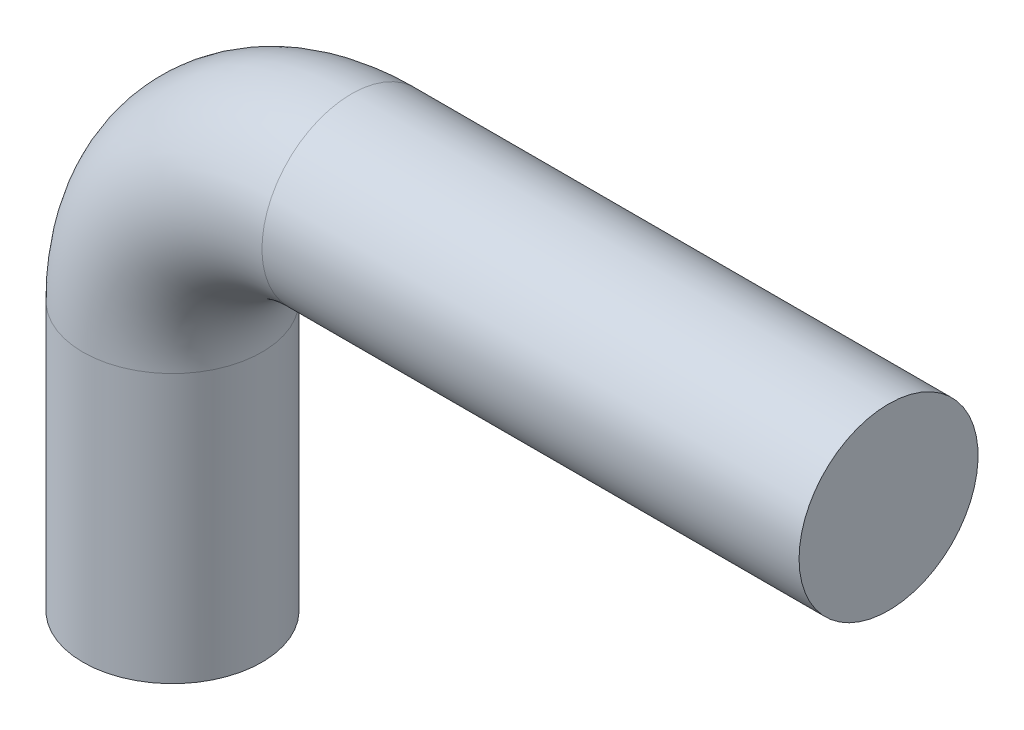
ISO-10303-21;
HEADER;
FILE_DESCRIPTION(('STEP AP214'),'2;1');
FILE_NAME('part.step','',(''),(''),'','','');
FILE_SCHEMA(('AUTOMOTIVE_DESIGN { 1 0 10303 214 1 1 1 1 }'));
ENDSEC;
DATA;
#1=APPLICATION_CONTEXT('core data for automotive mechanical design processes');
#2=APPLICATION_PROTOCOL_DEFINITION('international standard','automotive_design',2000,#1);
#3=PRODUCT_CONTEXT('',#1,'mechanical');
#4=PRODUCT('Part','Part','',(#3));
#5=PRODUCT_RELATED_PRODUCT_CATEGORY('part','',(#4));
#6=PRODUCT_DEFINITION_FORMATION('','',#4);
#7=PRODUCT_DEFINITION_CONTEXT('part definition',#1,'design');
#8=PRODUCT_DEFINITION('design','',#6,#7);
#9=PRODUCT_DEFINITION_SHAPE('','',#8);
#10=(LENGTH_UNIT() NAMED_UNIT(*) SI_UNIT(.MILLI.,.METRE.));
#11=(NAMED_UNIT(*) PLANE_ANGLE_UNIT() SI_UNIT($,.RADIAN.));
#12=(NAMED_UNIT(*) SI_UNIT($,.STERADIAN.) SOLID_ANGLE_UNIT());
#13=UNCERTAINTY_MEASURE_WITH_UNIT(LENGTH_MEASURE(1.E-05),#10,'distance_accuracy_value','');
#14=(GEOMETRIC_REPRESENTATION_CONTEXT(3) GLOBAL_UNCERTAINTY_ASSIGNED_CONTEXT((#13)) GLOBAL_UNIT_ASSIGNED_CONTEXT((#10,
#11,#12)) REPRESENTATION_CONTEXT('',''));
#15=CARTESIAN_POINT('',(0.,0.,0.));
#16=DIRECTION('',(0.,0.,1.));
#17=DIRECTION('',(1.,0.,0.));
#18=AXIS2_PLACEMENT_3D('',#15,#16,#17);
#19=CARTESIAN_POINT('',(0.,0.,0.));
#20=DIRECTION('',(0.,-1.,0.));
#21=DIRECTION('',(0.,0.,1.));
#22=AXIS2_PLACEMENT_3D('',#19,#20,#21);
#23=PLANE('',#22);
#24=CARTESIAN_POINT('',(0.,0.,0.));
#25=DIRECTION('',(0.,-1.,0.));
#26=DIRECTION('',(0.,0.,1.));
#27=AXIS2_PLACEMENT_3D('',#24,#25,#26);
#28=CIRCLE('',#27,5.);
#29=CARTESIAN_POINT('',(0.,0.,5.));
#30=VERTEX_POINT('',#29);
#31=EDGE_CURVE('E59',#30,#30,#28,.T.);
#32=ORIENTED_EDGE('',*,*,#31,.T.);
#33=EDGE_LOOP('',(#32));
#34=FACE_BOUND('',#33,.T.);
#35=ADVANCED_FACE('F45',(#34),#23,.T.);
#36=CARTESIAN_POINT('',(40.,25.,0.));
#37=DIRECTION('',(-1.,0.,0.));
#38=DIRECTION('',(0.,0.,1.));
#39=AXIS2_PLACEMENT_3D('',#36,#37,#38);
#40=PLANE('',#39);
#41=CARTESIAN_POINT('',(40.,25.,0.));
#42=DIRECTION('',(-1.,0.,0.));
#43=DIRECTION('',(0.,0.,1.));
#44=AXIS2_PLACEMENT_3D('',#41,#42,#43);
#45=CIRCLE('',#44,5.);
#46=CARTESIAN_POINT('',(40.,25.,5.));
#47=VERTEX_POINT('',#46);
#48=EDGE_CURVE('E11',#47,#47,#45,.T.);
#49=ORIENTED_EDGE('',*,*,#48,.F.);
#50=EDGE_LOOP('',(#49));
#51=FACE_BOUND('',#50,.T.);
#52=ADVANCED_FACE('F69',(#51),#40,.F.);
#53=CARTESIAN_POINT('',(0.,0.,0.));
#54=DIRECTION('',(0.,1.,0.));
#55=DIRECTION('',(0.,0.,1.));
#56=AXIS2_PLACEMENT_3D('',#53,#54,#55);
#57=CYLINDRICAL_SURFACE('',#56,5.);
#58=CARTESIAN_POINT('',(0.,15.,0.));
#59=DIRECTION('',(0.,-1.,0.));
#60=DIRECTION('',(0.,0.,1.));
#61=AXIS2_PLACEMENT_3D('',#58,#59,#60);
#62=CIRCLE('',#61,5.);
#63=CARTESIAN_POINT('',(-5.,15.,0.));
#64=VERTEX_POINT('',#63);
#65=EDGE_CURVE('E55',#64,#64,#62,.T.);
#66=ORIENTED_EDGE('',*,*,#65,.T.);
#67=EDGE_LOOP('',(#66));
#68=FACE_BOUND('',#67,.T.);
#69=ORIENTED_EDGE('',*,*,#31,.F.);
#70=EDGE_LOOP('',(#69));
#71=FACE_BOUND('',#70,.T.);
#72=ADVANCED_FACE('F66',(#68,#71),#57,.T.);
#73=CARTESIAN_POINT('',(10.,15.,0.));
#74=DIRECTION('',(0.,0.,-1.));
#75=DIRECTION('',(-1.,0.,0.));
#76=AXIS2_PLACEMENT_3D('',#73,#74,#75);
#77=TOROIDAL_SURFACE('',#76,10.,5.);
#78=CARTESIAN_POINT('',(10.,25.,0.));
#79=DIRECTION('',(-1.,0.,0.));
#80=DIRECTION('',(0.,0.,1.));
#81=AXIS2_PLACEMENT_3D('',#78,#79,#80);
#82=CIRCLE('',#81,5.);
#83=CARTESIAN_POINT('',(10.,30.,0.));
#84=VERTEX_POINT('',#83);
#85=EDGE_CURVE('E51',#84,#84,#82,.T.);
#86=CARTESIAN_POINT('',(10.,15.,0.));
#87=DIRECTION('',(0.,0.,-1.));
#88=DIRECTION('',(-1.,0.,0.));
#89=AXIS2_PLACEMENT_3D('',#86,#87,#88);
#90=CIRCLE('',#89,15.);
#91=EDGE_CURVE('',#64,#84,#90,.T.);
#92=ORIENTED_EDGE('',*,*,#65,.F.);
#93=ORIENTED_EDGE('',*,*,#85,.T.);
#94=ORIENTED_EDGE('',*,*,#91,.T.);
#95=ORIENTED_EDGE('',*,*,#91,.F.);
#96=EDGE_LOOP('',(#92,#94,#93,#95));
#97=FACE_BOUND('',#96,.T.);
#98=ADVANCED_FACE('F68',(#97),#77,.T.);
#99=CARTESIAN_POINT('',(10.,25.,0.));
#100=DIRECTION('',(1.,0.,0.));
#101=DIRECTION('',(0.,0.,-1.));
#102=AXIS2_PLACEMENT_3D('',#99,#100,#101);
#103=CYLINDRICAL_SURFACE('',#102,5.);
#104=ORIENTED_EDGE('',*,*,#48,.T.);
#105=EDGE_LOOP('',(#104));
#106=FACE_BOUND('',#105,.T.);
#107=ORIENTED_EDGE('',*,*,#85,.F.);
#108=EDGE_LOOP('',(#107));
#109=FACE_BOUND('',#108,.T.);
#110=ADVANCED_FACE('F76',(#106,#109),#103,.T.);
#111=CLOSED_SHELL('',(#35,#52,#72,#98,#110));
#112=MANIFOLD_SOLID_BREP('B2',#111);
#113=ADVANCED_BREP_SHAPE_REPRESENTATION('',(#18,#112),#14);
#114=SHAPE_DEFINITION_REPRESENTATION(#9,#113);
ENDSEC;
END-ISO-10303-21;
